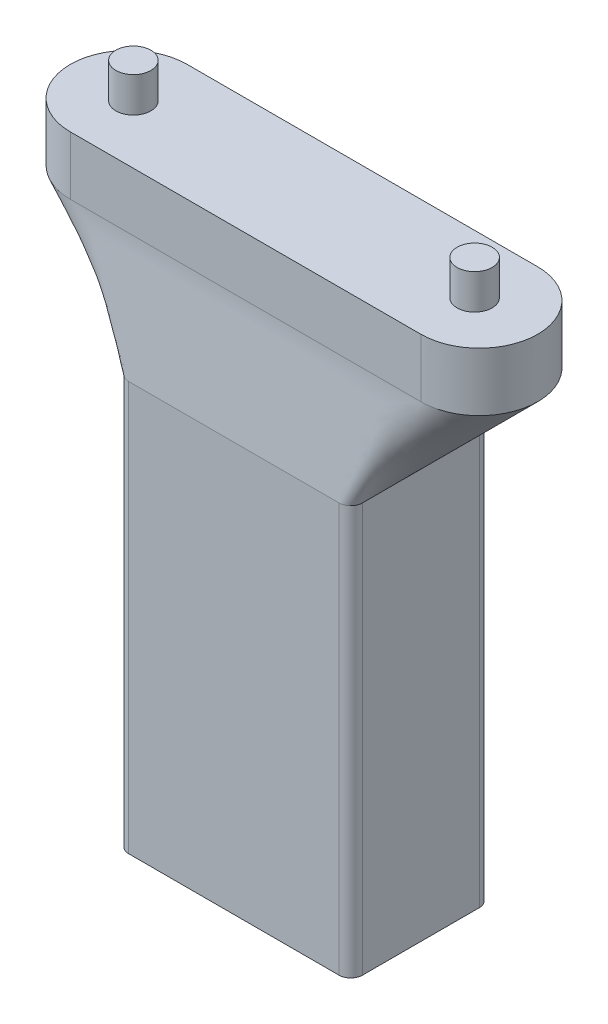
ISO-10303-21;
HEADER;
FILE_DESCRIPTION(('STEP AP214'),'2;1');
FILE_NAME('part.step','',(''),(''),'','','');
FILE_SCHEMA(('AUTOMOTIVE_DESIGN { 1 0 10303 214 1 1 1 1 }'));
ENDSEC;
DATA;
#1=APPLICATION_CONTEXT('core data for automotive mechanical design processes');
#2=APPLICATION_PROTOCOL_DEFINITION('international standard','automotive_design',2000,#1);
#3=PRODUCT_CONTEXT('',#1,'mechanical');
#4=PRODUCT('Part','Part','',(#3));
#5=PRODUCT_RELATED_PRODUCT_CATEGORY('part','',(#4));
#6=PRODUCT_DEFINITION_FORMATION('','',#4);
#7=PRODUCT_DEFINITION_CONTEXT('part definition',#1,'design');
#8=PRODUCT_DEFINITION('design','',#6,#7);
#9=PRODUCT_DEFINITION_SHAPE('','',#8);
#10=(LENGTH_UNIT() NAMED_UNIT(*) SI_UNIT(.MILLI.,.METRE.));
#11=(NAMED_UNIT(*) PLANE_ANGLE_UNIT() SI_UNIT($,.RADIAN.));
#12=(NAMED_UNIT(*) SI_UNIT($,.STERADIAN.) SOLID_ANGLE_UNIT());
#13=UNCERTAINTY_MEASURE_WITH_UNIT(LENGTH_MEASURE(1.E-05),#10,'distance_accuracy_value','');
#14=(GEOMETRIC_REPRESENTATION_CONTEXT(3) GLOBAL_UNCERTAINTY_ASSIGNED_CONTEXT((#13)) GLOBAL_UNIT_ASSIGNED_CONTEXT((#10,
#11,#12)) REPRESENTATION_CONTEXT('',''));
#15=CARTESIAN_POINT('',(0.,0.,0.));
#16=DIRECTION('',(0.,0.,1.));
#17=DIRECTION('',(1.,0.,0.));
#18=AXIS2_PLACEMENT_3D('',#15,#16,#17);
#19=CARTESIAN_POINT('',(0.,5.,0.));
#20=DIRECTION('',(0.,1.,0.));
#21=DIRECTION('',(0.,0.,1.));
#22=AXIS2_PLACEMENT_3D('',#19,#20,#21);
#23=PLANE('',#22);
#24=CARTESIAN_POINT('',(-35.8945814641997,5.,25.5133400592117));
#25=DIRECTION('',(0.,1.,0.));
#26=DIRECTION('',(0.,0.,1.));
#27=AXIS2_PLACEMENT_3D('',#24,#25,#26);
#28=CIRCLE('',#27,1.5);
#29=CARTESIAN_POINT('',(-35.8945814641997,5.,27.0133400592117));
#30=VERTEX_POINT('',#29);
#31=EDGE_CURVE('E12',#30,#30,#28,.T.);
#32=ORIENTED_EDGE('',*,*,#31,.F.);
#33=EDGE_LOOP('',(#32));
#34=FACE_BOUND('',#33,.T.);
#35=CARTESIAN_POINT('',(-6.69458146419971,5.,25.5133400592117));
#36=DIRECTION('',(0.,1.,0.));
#37=DIRECTION('',(0.,0.,1.));
#38=AXIS2_PLACEMENT_3D('',#35,#36,#37);
#39=CIRCLE('',#38,1.5);
#40=CARTESIAN_POINT('',(-6.69458146419971,5.,27.0133400592117));
#41=VERTEX_POINT('',#40);
#42=EDGE_CURVE('E644',#41,#41,#39,.T.);
#43=ORIENTED_EDGE('',*,*,#42,.F.);
#44=EDGE_LOOP('',(#43));
#45=FACE_BOUND('',#44,.T.);
#46=DIRECTION('',(1.,0.,0.));
#47=VECTOR('',#46,1.);
#48=CARTESIAN_POINT('',(0.,5.,30.5133400592117));
#49=LINE('',#48,#47);
#50=CARTESIAN_POINT('',(-36.2945814641997,5.,30.5133400592117));
#51=VERTEX_POINT('',#50);
#52=CARTESIAN_POINT('',(-6.29458146419974,5.,30.5133400592117));
#53=VERTEX_POINT('',#52);
#54=EDGE_CURVE('E647',#51,#53,#49,.T.);
#55=ORIENTED_EDGE('',*,*,#54,.T.);
#56=CARTESIAN_POINT('',(-6.2945814641997,5.,25.5133400592117));
#57=DIRECTION('',(0.,1.,0.));
#58=DIRECTION('',(0.,0.,1.));
#59=AXIS2_PLACEMENT_3D('',#56,#57,#58);
#60=CIRCLE('',#59,5.);
#61=CARTESIAN_POINT('',(-6.29458146419974,5.,20.5133400592117));
#62=VERTEX_POINT('',#61);
#63=EDGE_CURVE('E605',#62,#53,#60,.F.);
#64=ORIENTED_EDGE('',*,*,#63,.F.);
#65=DIRECTION('',(1.,0.,0.));
#66=VECTOR('',#65,1.);
#67=CARTESIAN_POINT('',(0.,5.,20.5133400592117));
#68=LINE('',#67,#66);
#69=CARTESIAN_POINT('',(-36.2945814641997,5.,20.5133400592117));
#70=VERTEX_POINT('',#69);
#71=EDGE_CURVE('E651',#70,#62,#68,.T.);
#72=ORIENTED_EDGE('',*,*,#71,.F.);
#73=CARTESIAN_POINT('',(-36.2945814641997,5.,25.5133400592117));
#74=DIRECTION('',(0.,1.,0.));
#75=DIRECTION('',(0.,0.,1.));
#76=AXIS2_PLACEMENT_3D('',#73,#74,#75);
#77=CIRCLE('',#76,5.);
#78=EDGE_CURVE('E280',#70,#51,#77,.T.);
#79=ORIENTED_EDGE('',*,*,#78,.T.);
#80=EDGE_LOOP('',(#55,#64,#72,#79));
#81=FACE_BOUND('',#80,.T.);
#82=ADVANCED_FACE('F239',(#34,#45,#81),#23,.T.);
#83=CARTESIAN_POINT('',(-35.8945814641997,8.,25.5133400592117));
#84=DIRECTION('',(0.,-1.,0.));
#85=DIRECTION('',(0.,0.,-1.));
#86=AXIS2_PLACEMENT_3D('',#83,#84,#85);
#87=CYLINDRICAL_SURFACE('',#86,1.5);
#88=CARTESIAN_POINT('',(-35.8945814641997,8.,25.5133400592117));
#89=DIRECTION('',(0.,1.,0.));
#90=DIRECTION('',(0.,0.,1.));
#91=AXIS2_PLACEMENT_3D('',#88,#89,#90);
#92=CIRCLE('',#91,1.5);
#93=CARTESIAN_POINT('',(-35.8945814641997,8.,27.0133400592117));
#94=VERTEX_POINT('',#93);
#95=EDGE_CURVE('E249',#94,#94,#92,.F.);
#96=ORIENTED_EDGE('',*,*,#95,.T.);
#97=EDGE_LOOP('',(#96));
#98=FACE_BOUND('',#97,.T.);
#99=ORIENTED_EDGE('',*,*,#31,.T.);
#100=EDGE_LOOP('',(#99));
#101=FACE_BOUND('',#100,.T.);
#102=ADVANCED_FACE('F633',(#98,#101),#87,.T.);
#103=CARTESIAN_POINT('',(0.,8.,0.));
#104=DIRECTION('',(0.,1.,0.));
#105=DIRECTION('',(0.,0.,1.));
#106=AXIS2_PLACEMENT_3D('',#103,#104,#105);
#107=PLANE('',#106);
#108=ORIENTED_EDGE('',*,*,#95,.F.);
#109=EDGE_LOOP('',(#108));
#110=FACE_BOUND('',#109,.T.);
#111=ADVANCED_FACE('F638',(#110),#107,.T.);
#112=CARTESIAN_POINT('',(-6.69458146419971,8.,25.5133400592117));
#113=DIRECTION('',(0.,-1.,0.));
#114=DIRECTION('',(0.,0.,-1.));
#115=AXIS2_PLACEMENT_3D('',#112,#113,#114);
#116=CYLINDRICAL_SURFACE('',#115,1.5);
#117=CARTESIAN_POINT('',(-6.69458146419971,8.,25.5133400592117));
#118=DIRECTION('',(0.,1.,0.));
#119=DIRECTION('',(0.,0.,1.));
#120=AXIS2_PLACEMENT_3D('',#117,#118,#119);
#121=CIRCLE('',#120,1.5);
#122=CARTESIAN_POINT('',(-6.69458146419971,8.,27.0133400592117));
#123=VERTEX_POINT('',#122);
#124=EDGE_CURVE('E654',#123,#123,#121,.T.);
#125=ORIENTED_EDGE('',*,*,#124,.F.);
#126=EDGE_LOOP('',(#125));
#127=FACE_BOUND('',#126,.T.);
#128=ORIENTED_EDGE('',*,*,#42,.T.);
#129=EDGE_LOOP('',(#128));
#130=FACE_BOUND('',#129,.T.);
#131=ADVANCED_FACE('F696',(#127,#130),#116,.T.);
#132=CARTESIAN_POINT('',(0.,8.,0.));
#133=DIRECTION('',(0.,1.,0.));
#134=DIRECTION('',(0.,0.,1.));
#135=AXIS2_PLACEMENT_3D('',#132,#133,#134);
#136=PLANE('',#135);
#137=ORIENTED_EDGE('',*,*,#124,.T.);
#138=EDGE_LOOP('',(#137));
#139=FACE_BOUND('',#138,.T.);
#140=ADVANCED_FACE('F680',(#139),#136,.T.);
#141=CARTESIAN_POINT('',(-36.2945814641997,0.,25.5133400592117));
#142=DIRECTION('',(0.,1.,0.));
#143=DIRECTION('',(0.,0.,1.));
#144=AXIS2_PLACEMENT_3D('',#141,#142,#143);
#145=CYLINDRICAL_SURFACE('',#144,5.);
#146=ORIENTED_EDGE('',*,*,#78,.F.);
#147=DIRECTION('',(0.,1.,0.));
#148=VECTOR('',#147,1.);
#149=CARTESIAN_POINT('',(-36.2945814641997,0.,20.5133400592117));
#150=LINE('',#149,#148);
#151=CARTESIAN_POINT('',(-36.2945814641997,0.,20.5133400592117));
#152=VERTEX_POINT('',#151);
#153=EDGE_CURVE('E257',#152,#70,#150,.T.);
#154=ORIENTED_EDGE('',*,*,#153,.F.);
#155=CARTESIAN_POINT('',(-6.29458146534728,0.,20.5133400592117));
#156=CARTESIAN_POINT('',(-5.64766332491657,0.,20.5133400592117));
#157=CARTESIAN_POINT('',(-4.3481647934617,0.,20.7675125474835));
#158=CARTESIAN_POINT('',(-2.6801952457436,0.,21.8717110803832));
#159=CARTESIAN_POINT('',(-1.55809888719889,0.,23.538457056297));
#160=CARTESIAN_POINT('',(-1.16253214015281,0.,25.5133400592118));
#161=CARTESIAN_POINT('',(-1.55809888719889,0.,27.4882230621264));
#162=CARTESIAN_POINT('',(-2.68019524574361,0.,29.1549690380402));
#163=CARTESIAN_POINT('',(-4.34816479346171,0.,30.25916757094));
#164=CARTESIAN_POINT('',(-5.64766332491658,0.,30.5133400592117));
#165=CARTESIAN_POINT('',(-6.47948771654112,0.,30.5133400592117));
#166=CARTESIAN_POINT('',(-6.8269866703791,0.,30.5133400592117));
#167=CARTESIAN_POINT('',(-7.32174343034788,0.,30.5133400592117));
#168=CARTESIAN_POINT('',(-7.81308682913417,0.,30.5133400592118));
#169=CARTESIAN_POINT('',(-8.15302398337131,0.,30.5133400592117));
#170=CARTESIAN_POINT('',(-10.4832783811346,0.,30.5133400592117));
#171=CARTESIAN_POINT('',(-14.7998372577758,0.,30.5133400592117));
#172=CARTESIAN_POINT('',(-21.2945814641997,0.,30.5133400592118));
#173=CARTESIAN_POINT('',(-27.7893256706236,0.,30.5133400592117));
#174=CARTESIAN_POINT('',(-32.1058845472648,0.,30.5133400592117));
#175=CARTESIAN_POINT('',(-34.4361389450281,0.,30.5133400592117));
#176=CARTESIAN_POINT('',(-34.7760760992652,0.,30.5133400592117));
#177=CARTESIAN_POINT('',(-35.2674194980516,0.,30.5133400592118));
#178=CARTESIAN_POINT('',(-35.7621762580203,0.,30.5133400592117));
#179=CARTESIAN_POINT('',(-36.1096752118583,0.,30.5133400592117));
#180=CARTESIAN_POINT('',(-36.9414996034828,0.,30.5133400592117));
#181=CARTESIAN_POINT('',(-38.2409981349377,0.,30.25916757094));
#182=CARTESIAN_POINT('',(-39.9089676826558,0.,29.1549690380402));
#183=CARTESIAN_POINT('',(-41.0310640412005,0.,27.4882230621264));
#184=CARTESIAN_POINT('',(-41.4266307882467,0.,25.5133400592117));
#185=CARTESIAN_POINT('',(-41.0310640412005,0.,23.5384570562971));
#186=CARTESIAN_POINT('',(-39.9089676826558,0.,21.8717110803832));
#187=CARTESIAN_POINT('',(-38.2409981349377,0.,20.7675125474835));
#188=CARTESIAN_POINT('',(-36.9414996034828,0.,20.5133400592117));
#189=CARTESIAN_POINT('',(-36.1096752118583,0.,20.5133400592117));
#190=CARTESIAN_POINT('',(-35.7621762580203,0.,20.5133400592117));
#191=CARTESIAN_POINT('',(-35.2674194980516,0.,20.5133400592117));
#192=CARTESIAN_POINT('',(-34.7760760992652,0.,20.5133400592117));
#193=CARTESIAN_POINT('',(-34.4361389450281,0.,20.5133400592117));
#194=CARTESIAN_POINT('',(-32.1058845472648,0.,20.5133400592117));
#195=CARTESIAN_POINT('',(-27.7893256706236,0.,20.5133400592118));
#196=CARTESIAN_POINT('',(-21.2945814641997,0.,20.5133400592117));
#197=CARTESIAN_POINT('',(-14.7998372577758,0.,20.5133400592118));
#198=CARTESIAN_POINT('',(-10.4832783811346,0.,20.5133400592117));
#199=CARTESIAN_POINT('',(-8.15302398337131,0.,20.5133400592117));
#200=CARTESIAN_POINT('',(-7.81308682913416,0.,20.5133400592117));
#201=CARTESIAN_POINT('',(-7.3217434303479,0.,20.5133400592117));
#202=CARTESIAN_POINT('',(-6.82698667037909,0.,20.5133400592117));
#203=CARTESIAN_POINT('',(-6.47948771654112,0.,20.5133400592117));
#204=CARTESIAN_POINT('',(-6.29458146534728,0.,20.5133400592117));
#205=B_SPLINE_CURVE_WITH_KNOTS('',3,(#155,#156,#157,#158,#159,#160,#161,#162,#163,#164,#165,
#166,#167,#168,#169,#170,#171,#172,#173,#174,#175,#176,#177,#178,#179,#180,#181,#182,#183,#184,
#185,#186,#187,#188,#189,#190,#191,#192,#193,#194,#195,#196,#197,#198,#199,#200,#201,#202,#203,
#204),.UNSPECIFIED.,.T.,.F.,(4,1,1,1,1,1,1,1,2,1,1,1,2,1,1,1,2,1,1,1,2,1,1,1,1,1,1,1,2,1,1,1,2,
1,1,1,2,1,1,1,4),(0.,0.0207741619169695,0.0415483238339387,0.0623224857509079,
0.0830966476678774,0.103870809584847,0.124644971501816,0.145419133418786,0.166193295335755,
0.172131098222536,0.178068901109318,0.184006703996099,0.18994450688288,0.261520577275379,
0.333096647667877,0.404672718060376,0.476248788452874,0.482186591339656,0.488124394226437,
0.494062197113219,0.5,0.520774161916969,0.541548323833939,0.562322485750908,0.583096647667877,
0.603870809584847,0.624644971501816,0.645419133418786,0.666193295335755,0.672131098222536,
0.678068901109318,0.684006703996099,0.68994450688288,0.761520577275379,0.833096647667877,
0.904672718060376,0.976248788452874,0.982186591339656,0.988124394226437,0.994062197113219,1.),.UNSPECIFIED.);
#206=CARTESIAN_POINT('',(-36.2945814641997,0.,30.5133400592117));
#207=VERTEX_POINT('',#206);
#208=EDGE_CURVE('E290',#152,#207,#205,.F.);
#209=ORIENTED_EDGE('',*,*,#208,.T.);
#210=DIRECTION('',(0.,1.,0.));
#211=VECTOR('',#210,1.);
#212=CARTESIAN_POINT('',(-36.2945814641997,0.,30.5133400592117));
#213=LINE('',#212,#211);
#214=EDGE_CURVE('E613',#207,#51,#213,.T.);
#215=ORIENTED_EDGE('',*,*,#214,.T.);
#216=EDGE_LOOP('',(#146,#154,#209,#215));
#217=FACE_BOUND('',#216,.T.);
#218=ADVANCED_FACE('F674',(#217),#145,.T.);
#219=CARTESIAN_POINT('',(-6.2945814641997,0.,25.5133400592117));
#220=DIRECTION('',(0.,1.,0.));
#221=DIRECTION('',(0.,0.,1.));
#222=AXIS2_PLACEMENT_3D('',#219,#220,#221);
#223=CYLINDRICAL_SURFACE('',#222,5.);
#224=ORIENTED_EDGE('',*,*,#63,.T.);
#225=DIRECTION('',(0.,1.,0.));
#226=VECTOR('',#225,1.);
#227=CARTESIAN_POINT('',(-6.29458146419974,0.,30.5133400592117));
#228=LINE('',#227,#226);
#229=CARTESIAN_POINT('',(-6.29458146419974,0.,30.5133400592117));
#230=VERTEX_POINT('',#229);
#231=EDGE_CURVE('E417',#230,#53,#228,.T.);
#232=ORIENTED_EDGE('',*,*,#231,.F.);
#233=CARTESIAN_POINT('',(-6.29458146534728,0.,20.5133400592117));
#234=CARTESIAN_POINT('',(-5.64766332491657,0.,20.5133400592117));
#235=CARTESIAN_POINT('',(-4.3481647934617,0.,20.7675125474835));
#236=CARTESIAN_POINT('',(-2.6801952457436,0.,21.8717110803832));
#237=CARTESIAN_POINT('',(-1.55809888719889,0.,23.538457056297));
#238=CARTESIAN_POINT('',(-1.16253214015281,0.,25.5133400592118));
#239=CARTESIAN_POINT('',(-1.55809888719889,0.,27.4882230621264));
#240=CARTESIAN_POINT('',(-2.68019524574361,0.,29.1549690380402));
#241=CARTESIAN_POINT('',(-4.34816479346171,0.,30.25916757094));
#242=CARTESIAN_POINT('',(-5.64766332491658,0.,30.5133400592117));
#243=CARTESIAN_POINT('',(-6.47948771654112,0.,30.5133400592117));
#244=CARTESIAN_POINT('',(-6.8269866703791,0.,30.5133400592117));
#245=CARTESIAN_POINT('',(-7.32174343034788,0.,30.5133400592117));
#246=CARTESIAN_POINT('',(-7.81308682913417,0.,30.5133400592118));
#247=CARTESIAN_POINT('',(-8.15302398337131,0.,30.5133400592117));
#248=CARTESIAN_POINT('',(-10.4832783811346,0.,30.5133400592117));
#249=CARTESIAN_POINT('',(-14.7998372577758,0.,30.5133400592117));
#250=CARTESIAN_POINT('',(-21.2945814641997,0.,30.5133400592118));
#251=CARTESIAN_POINT('',(-27.7893256706236,0.,30.5133400592117));
#252=CARTESIAN_POINT('',(-32.1058845472648,0.,30.5133400592117));
#253=CARTESIAN_POINT('',(-34.4361389450281,0.,30.5133400592117));
#254=CARTESIAN_POINT('',(-34.7760760992652,0.,30.5133400592117));
#255=CARTESIAN_POINT('',(-35.2674194980516,0.,30.5133400592118));
#256=CARTESIAN_POINT('',(-35.7621762580203,0.,30.5133400592117));
#257=CARTESIAN_POINT('',(-36.1096752118583,0.,30.5133400592117));
#258=CARTESIAN_POINT('',(-36.9414996034828,0.,30.5133400592117));
#259=CARTESIAN_POINT('',(-38.2409981349377,0.,30.25916757094));
#260=CARTESIAN_POINT('',(-39.9089676826558,0.,29.1549690380402));
#261=CARTESIAN_POINT('',(-41.0310640412005,0.,27.4882230621264));
#262=CARTESIAN_POINT('',(-41.4266307882467,0.,25.5133400592117));
#263=CARTESIAN_POINT('',(-41.0310640412005,0.,23.5384570562971));
#264=CARTESIAN_POINT('',(-39.9089676826558,0.,21.8717110803832));
#265=CARTESIAN_POINT('',(-38.2409981349377,0.,20.7675125474835));
#266=CARTESIAN_POINT('',(-36.9414996034828,0.,20.5133400592117));
#267=CARTESIAN_POINT('',(-36.1096752118583,0.,20.5133400592117));
#268=CARTESIAN_POINT('',(-35.7621762580203,0.,20.5133400592117));
#269=CARTESIAN_POINT('',(-35.2674194980516,0.,20.5133400592117));
#270=CARTESIAN_POINT('',(-34.7760760992652,0.,20.5133400592117));
#271=CARTESIAN_POINT('',(-34.4361389450281,0.,20.5133400592117));
#272=CARTESIAN_POINT('',(-32.1058845472648,0.,20.5133400592117));
#273=CARTESIAN_POINT('',(-27.7893256706236,0.,20.5133400592118));
#274=CARTESIAN_POINT('',(-21.2945814641997,0.,20.5133400592117));
#275=CARTESIAN_POINT('',(-14.7998372577758,0.,20.5133400592118));
#276=CARTESIAN_POINT('',(-10.4832783811346,0.,20.5133400592117));
#277=CARTESIAN_POINT('',(-8.15302398337131,0.,20.5133400592117));
#278=CARTESIAN_POINT('',(-7.81308682913416,0.,20.5133400592117));
#279=CARTESIAN_POINT('',(-7.3217434303479,0.,20.5133400592117));
#280=CARTESIAN_POINT('',(-6.82698667037909,0.,20.5133400592117));
#281=CARTESIAN_POINT('',(-6.47948771654112,0.,20.5133400592117));
#282=CARTESIAN_POINT('',(-6.29458146534728,0.,20.5133400592117));
#283=B_SPLINE_CURVE_WITH_KNOTS('',3,(#233,#234,#235,#236,#237,#238,#239,#240,#241,#242,#243,
#244,#245,#246,#247,#248,#249,#250,#251,#252,#253,#254,#255,#256,#257,#258,#259,#260,#261,#262,
#263,#264,#265,#266,#267,#268,#269,#270,#271,#272,#273,#274,#275,#276,#277,#278,#279,#280,#281,
#282),.UNSPECIFIED.,.T.,.F.,(4,1,1,1,1,1,1,1,2,1,1,1,2,1,1,1,2,1,1,1,2,1,1,1,1,1,1,1,2,1,1,1,2,
1,1,1,2,1,1,1,4),(0.,0.0207741619169695,0.0415483238339387,0.0623224857509079,
0.0830966476678774,0.103870809584847,0.124644971501816,0.145419133418786,0.166193295335755,
0.172131098222536,0.178068901109318,0.184006703996099,0.18994450688288,0.261520577275379,
0.333096647667877,0.404672718060376,0.476248788452874,0.482186591339656,0.488124394226437,
0.494062197113219,0.5,0.520774161916969,0.541548323833939,0.562322485750908,0.583096647667877,
0.603870809584847,0.624644971501816,0.645419133418786,0.666193295335755,0.672131098222536,
0.678068901109318,0.684006703996099,0.68994450688288,0.761520577275379,0.833096647667877,
0.904672718060376,0.976248788452874,0.982186591339656,0.988124394226437,0.994062197113219,1.),.UNSPECIFIED.);
#284=CARTESIAN_POINT('',(-6.29458146419974,0.,20.5133400592117));
#285=VERTEX_POINT('',#284);
#286=EDGE_CURVE('E598',#285,#230,#283,.T.);
#287=ORIENTED_EDGE('',*,*,#286,.F.);
#288=DIRECTION('',(0.,1.,0.));
#289=VECTOR('',#288,1.);
#290=CARTESIAN_POINT('',(-6.29458146419974,0.,20.5133400592117));
#291=LINE('',#290,#289);
#292=EDGE_CURVE('E602',#285,#62,#291,.T.);
#293=ORIENTED_EDGE('',*,*,#292,.T.);
#294=EDGE_LOOP('',(#224,#232,#287,#293));
#295=FACE_BOUND('',#294,.T.);
#296=ADVANCED_FACE('F664',(#295),#223,.T.);
#297=CARTESIAN_POINT('',(0.,0.,20.5133400592117));
#298=DIRECTION('',(0.,0.,1.));
#299=DIRECTION('',(1.,0.,0.));
#300=AXIS2_PLACEMENT_3D('',#297,#298,#299);
#301=PLANE('',#300);
#302=ORIENTED_EDGE('',*,*,#71,.T.);
#303=ORIENTED_EDGE('',*,*,#292,.F.);
#304=DIRECTION('',(1.,0.,0.));
#305=VECTOR('',#304,1.);
#306=CARTESIAN_POINT('',(0.,0.,20.5133400592117));
#307=LINE('',#306,#305);
#308=EDGE_CURVE('E599',#152,#285,#307,.T.);
#309=ORIENTED_EDGE('',*,*,#308,.F.);
#310=ORIENTED_EDGE('',*,*,#153,.T.);
#311=EDGE_LOOP('',(#302,#303,#309,#310));
#312=FACE_BOUND('',#311,.T.);
#313=ADVANCED_FACE('F673',(#312),#301,.F.);
#314=CARTESIAN_POINT('',(0.,0.,30.5133400592117));
#315=DIRECTION('',(0.,0.,1.));
#316=DIRECTION('',(1.,0.,0.));
#317=AXIS2_PLACEMENT_3D('',#314,#315,#316);
#318=PLANE('',#317);
#319=ORIENTED_EDGE('',*,*,#54,.F.);
#320=ORIENTED_EDGE('',*,*,#214,.F.);
#321=DIRECTION('',(1.,0.,0.));
#322=VECTOR('',#321,1.);
#323=CARTESIAN_POINT('',(0.,0.,30.5133400592117));
#324=LINE('',#323,#322);
#325=EDGE_CURVE('E272',#207,#230,#324,.T.);
#326=ORIENTED_EDGE('',*,*,#325,.T.);
#327=ORIENTED_EDGE('',*,*,#231,.T.);
#328=EDGE_LOOP('',(#319,#320,#326,#327));
#329=FACE_BOUND('',#328,.T.);
#330=ADVANCED_FACE('F543',(#329),#318,.T.);
#331=CARTESIAN_POINT('',(-11.2945814641997,-10.,20.5133400598219));
#332=CARTESIAN_POINT('',(-6.29458146534728,0.,20.5133400592117));
#333=CARTESIAN_POINT('',(-11.2945814641997,-10.,20.3927695681912));
#334=CARTESIAN_POINT('',(-6.47948771654112,0.,20.5133400592117));
#335=CARTESIAN_POINT('',(-11.3388989244325,-10.,20.1395078354954));
#336=CARTESIAN_POINT('',(-6.82698667037909,0.,20.5133400592117));
#337=CARTESIAN_POINT('',(-11.561058059709,-9.99999999999996,19.7922667452044));
#338=CARTESIAN_POINT('',(-7.3217434303479,0.,20.5133400592117));
#339=CARTESIAN_POINT('',(-11.9085695661853,-10.,19.5611472862102));
#340=CARTESIAN_POINT('',(-7.81308682913416,0.,20.5133400592117));
#341=CARTESIAN_POINT('',(-12.1696494947626,-10.,19.5133400592117));
#342=CARTESIAN_POINT('',(-8.15302398337131,0.,20.5133400592117));
#343=CARTESIAN_POINT('',(-13.8005491878493,-10.,19.5133400592117));
#344=CARTESIAN_POINT('',(-10.4832783811346,0.,20.5133400592117));
#345=CARTESIAN_POINT('',(-16.8034805635051,-9.99999999999999,19.5133400592117));
#346=CARTESIAN_POINT('',(-14.7998372577758,0.,20.5133400592118));
#347=CARTESIAN_POINT('',(-21.2945814641997,-10.,19.5133400592117));
#348=CARTESIAN_POINT('',(-21.2945814641997,0.,20.5133400592117));
#349=CARTESIAN_POINT('',(-25.7856823648944,-9.99999999999999,19.5133400592117));
#350=CARTESIAN_POINT('',(-27.7893256706236,0.,20.5133400592118));
#351=CARTESIAN_POINT('',(-28.7886137405501,-10.,19.5133400592117));
#352=CARTESIAN_POINT('',(-32.1058845472648,0.,20.5133400592117));
#353=CARTESIAN_POINT('',(-30.4195134336368,-10.,19.5133400592117));
#354=CARTESIAN_POINT('',(-34.4361389450281,0.,20.5133400592117));
#355=CARTESIAN_POINT('',(-30.680593362214,-9.99999999999999,19.5611472862101));
#356=CARTESIAN_POINT('',(-34.7760760992652,0.,20.5133400592117));
#357=CARTESIAN_POINT('',(-31.0281048686905,-10.,19.7922667452044));
#358=CARTESIAN_POINT('',(-35.2674194980516,0.,20.5133400592117));
#359=CARTESIAN_POINT('',(-31.2502640039669,-9.99999999999999,20.1395078354953));
#360=CARTESIAN_POINT('',(-35.7621762580203,0.,20.5133400592117));
#361=CARTESIAN_POINT('',(-31.2945814641997,-10.,20.3927695681912));
#362=CARTESIAN_POINT('',(-36.1096752118583,0.,20.5133400592117));
#363=CARTESIAN_POINT('',(-31.2945814641997,-10.,20.9351713269257));
#364=CARTESIAN_POINT('',(-36.9414996034828,0.,20.5133400592117));
#365=CARTESIAN_POINT('',(-31.2945814641997,-10.,21.7748902660275));
#366=CARTESIAN_POINT('',(-38.2409981349377,0.,20.7675125474835));
#367=CARTESIAN_POINT('',(-31.2945814641997,-9.99999999999999,23.0257358740278));
#368=CARTESIAN_POINT('',(-39.9089676826558,0.,21.8717110803832));
#369=CARTESIAN_POINT('',(-31.2945814641997,-10.,24.2709466697014));
#370=CARTESIAN_POINT('',(-41.0310640412005,0.,23.5384570562971));
#371=CARTESIAN_POINT('',(-31.2945814641997,-10.,25.5133400592117));
#372=CARTESIAN_POINT('',(-41.4266307882467,0.,25.5133400592117));
#373=CARTESIAN_POINT('',(-31.2945814641997,-10.,26.755733448722));
#374=CARTESIAN_POINT('',(-41.0310640412005,0.,27.4882230621264));
#375=CARTESIAN_POINT('',(-31.2945814641997,-9.99999999999999,28.0009442443957));
#376=CARTESIAN_POINT('',(-39.9089676826558,0.,29.1549690380402));
#377=CARTESIAN_POINT('',(-31.2945814641997,-10.,29.251789852396));
#378=CARTESIAN_POINT('',(-38.2409981349377,0.,30.25916757094));
#379=CARTESIAN_POINT('',(-31.2945814641997,-10.,30.0915087914978));
#380=CARTESIAN_POINT('',(-36.9414996034828,0.,30.5133400592117));
#381=CARTESIAN_POINT('',(-31.2945814641997,-10.,30.6339105502323));
#382=CARTESIAN_POINT('',(-36.1096752118583,0.,30.5133400592117));
#383=CARTESIAN_POINT('',(-31.250264003967,-10.,30.8871722829281));
#384=CARTESIAN_POINT('',(-35.7621762580203,0.,30.5133400592117));
#385=CARTESIAN_POINT('',(-31.0281048686904,-9.99999999999998,31.2344133732191));
#386=CARTESIAN_POINT('',(-35.2674194980516,0.,30.5133400592118));
#387=CARTESIAN_POINT('',(-30.6805933622141,-10.,31.4655328322133));
#388=CARTESIAN_POINT('',(-34.7760760992652,0.,30.5133400592117));
#389=CARTESIAN_POINT('',(-30.4195134336368,-10.,31.5133400592117));
#390=CARTESIAN_POINT('',(-34.4361389450281,0.,30.5133400592117));
#391=CARTESIAN_POINT('',(-28.7886137405501,-10.,31.5133400592117));
#392=CARTESIAN_POINT('',(-32.1058845472648,0.,30.5133400592117));
#393=CARTESIAN_POINT('',(-25.7856823648943,-10.,31.5133400592117));
#394=CARTESIAN_POINT('',(-27.7893256706236,0.,30.5133400592117));
#395=CARTESIAN_POINT('',(-21.2945814641997,-10.,31.5133400592117));
#396=CARTESIAN_POINT('',(-21.2945814641997,0.,30.5133400592118));
#397=CARTESIAN_POINT('',(-16.8034805635051,-10.,31.5133400592118));
#398=CARTESIAN_POINT('',(-14.7998372577758,0.,30.5133400592117));
#399=CARTESIAN_POINT('',(-13.8005491878493,-10.,31.5133400592117));
#400=CARTESIAN_POINT('',(-10.4832783811346,0.,30.5133400592117));
#401=CARTESIAN_POINT('',(-12.1696494947626,-10.,31.5133400592117));
#402=CARTESIAN_POINT('',(-8.15302398337131,0.,30.5133400592117));
#403=CARTESIAN_POINT('',(-11.9085695661853,-9.99999999999999,31.4655328322133));
#404=CARTESIAN_POINT('',(-7.81308682913417,0.,30.5133400592118));
#405=CARTESIAN_POINT('',(-11.561058059709,-10.,31.2344133732191));
#406=CARTESIAN_POINT('',(-7.32174343034788,0.,30.5133400592117));
#407=CARTESIAN_POINT('',(-11.3388989244325,-10.,30.8871722829281));
#408=CARTESIAN_POINT('',(-6.8269866703791,0.,30.5133400592117));
#409=CARTESIAN_POINT('',(-11.2945814641997,-10.,30.6339105502323));
#410=CARTESIAN_POINT('',(-6.47948771654112,0.,30.5133400592117));
#411=CARTESIAN_POINT('',(-11.2945814641997,-10.,30.0915087914978));
#412=CARTESIAN_POINT('',(-5.64766332491657,0.,30.5133400592117));
#413=CARTESIAN_POINT('',(-11.2945814641997,-10.,29.251789852396));
#414=CARTESIAN_POINT('',(-4.34816479346171,0.,30.25916757094));
#415=CARTESIAN_POINT('',(-11.2945814641997,-10.,28.0009442443957));
#416=CARTESIAN_POINT('',(-2.6801952457436,0.,29.1549690380402));
#417=CARTESIAN_POINT('',(-11.2945814641997,-10.,26.755733448722));
#418=CARTESIAN_POINT('',(-1.55809888719889,0.,27.4882230621264));
#419=CARTESIAN_POINT('',(-11.2945814641997,-9.99999999999999,25.5133400592117));
#420=CARTESIAN_POINT('',(-1.1625321401528,0.,25.5133400592118));
#421=CARTESIAN_POINT('',(-11.2945814641997,-10.,24.2709466697014));
#422=CARTESIAN_POINT('',(-1.55809888719889,0.,23.538457056297));
#423=CARTESIAN_POINT('',(-11.2945814641997,-10.,23.0257358740278));
#424=CARTESIAN_POINT('',(-2.6801952457436,0.,21.8717110803832));
#425=CARTESIAN_POINT('',(-11.2945814641997,-10.,21.7748902660275));
#426=CARTESIAN_POINT('',(-4.3481647934617,0.,20.7675125474835));
#427=CARTESIAN_POINT('',(-11.2945814641997,-10.,20.9351713269257));
#428=CARTESIAN_POINT('',(-5.64766332491657,0.,20.5133400592117));
#429=CARTESIAN_POINT('',(-11.2945814641997,-10.,20.5133400598219));
#430=CARTESIAN_POINT('',(-6.29458146534728,0.,20.5133400592117));
#431=B_SPLINE_SURFACE_WITH_KNOTS('',3,1,((#331,#332),(#333,#334),(#335,#336),(#337,#338),(#339,
#340),(#341,#342),(#343,#344),(#345,#346),(#347,#348),(#349,#350),(#351,#352),(#353,#354),(#355,
#356),(#357,#358),(#359,#360),(#361,#362),(#363,#364),(#365,#366),(#367,#368),(#369,#370),(#371,
#372),(#373,#374),(#375,#376),(#377,#378),(#379,#380),(#381,#382),(#383,#384),(#385,#386),(#387,
#388),(#389,#390),(#391,#392),(#393,#394),(#395,#396),(#397,#398),(#399,#400),(#401,#402),(#403,
#404),(#405,#406),(#407,#408),(#409,#410),(#411,#412),(#413,#414),(#415,#416),(#417,#418),(#419,
#420),(#421,#422),(#423,#424),(#425,#426),(#427,#428),(#429,#430)),.UNSPECIFIED.,.T.,.F.,.F.,(4,
1,1,1,2,1,1,1,2,1,1,1,2,1,1,1,1,1,1,1,2,1,1,1,2,1,1,1,2,1,1,1,2,1,1,1,1,1,1,1,4),(2,2),(0.,
0.00593780288678138,0.0118756057735628,0.0178134086603442,0.0237512115471255,0.095327281939624,
0.166903352332123,0.238479422724621,0.31005549311712,0.315993296003901,0.321931098890682,
0.327868901777464,0.333806704664245,0.354580866581215,0.375355028498184,0.396129190415153,
0.416903352332123,0.437677514249092,0.458451676166061,0.479225838083031,0.5,0.505937802886781,
0.511875605773563,0.517813408660344,0.523751211547126,0.595327281939624,0.666903352332123,
0.738479422724621,0.81005549311712,0.815993296003901,0.821931098890682,0.827868901777464,
0.833806704664245,0.854580866581214,0.875355028498184,0.896129190415153,0.916903352332123,
0.937677514249092,0.958451676166061,0.979225838083031,1.),(0.,1.),.UNSPECIFIED.);
#432=CARTESIAN_POINT('',(-30.2945814641997,-10.,20.5133400592117));
#433=DIRECTION('',(0.,-1.,0.));
#434=DIRECTION('',(0.,0.,-1.));
#435=AXIS2_PLACEMENT_3D('',#432,#433,#434);
#436=CIRCLE('',#435,1.);
#437=CARTESIAN_POINT('',(-31.2945814641997,-10.,20.5133400592117));
#438=VERTEX_POINT('',#437);
#439=CARTESIAN_POINT('',(-30.2945814641997,-10.,19.5133400592117));
#440=VERTEX_POINT('',#439);
#441=EDGE_CURVE('E242',#438,#440,#436,.T.);
#442=DIRECTION('',(0.,0.,-1.));
#443=VECTOR('',#442,1.);
#444=CARTESIAN_POINT('',(-31.2945814641997,-10.,30.5133400592117));
#445=LINE('',#444,#443);
#446=CARTESIAN_POINT('',(-31.2945814641997,-10.,30.5133400592117));
#447=VERTEX_POINT('',#446);
#448=EDGE_CURVE('E369',#447,#438,#445,.T.);
#449=CARTESIAN_POINT('',(-30.2945814641997,-10.,30.5133400592117));
#450=DIRECTION('',(0.,-1.,0.));
#451=DIRECTION('',(0.,0.,-1.));
#452=AXIS2_PLACEMENT_3D('',#449,#450,#451);
#453=CIRCLE('',#452,1.);
#454=CARTESIAN_POINT('',(-30.2945814641997,-10.,31.5133400592117));
#455=VERTEX_POINT('',#454);
#456=EDGE_CURVE('E459',#455,#447,#453,.T.);
#457=DIRECTION('',(-1.,0.,0.));
#458=VECTOR('',#457,1.);
#459=CARTESIAN_POINT('',(-30.2945814641997,-10.,31.5133400592117));
#460=LINE('',#459,#458);
#461=CARTESIAN_POINT('',(-12.2945814641997,-10.,31.5133400592117));
#462=VERTEX_POINT('',#461);
#463=EDGE_CURVE('E448',#462,#455,#460,.T.);
#464=CARTESIAN_POINT('',(-12.2945814641997,-10.,30.5133400592117));
#465=DIRECTION('',(0.,-1.,0.));
#466=DIRECTION('',(0.,0.,-1.));
#467=AXIS2_PLACEMENT_3D('',#464,#465,#466);
#468=CIRCLE('',#467,1.);
#469=CARTESIAN_POINT('',(-11.2945814641997,-10.,30.5133400592117));
#470=VERTEX_POINT('',#469);
#471=EDGE_CURVE('E433',#470,#462,#468,.T.);
#472=DIRECTION('',(0.,0.,1.));
#473=VECTOR('',#472,1.);
#474=CARTESIAN_POINT('',(-11.2945814641997,-10.,30.5133400592117));
#475=LINE('',#474,#473);
#476=CARTESIAN_POINT('',(-11.2945814641997,-10.,20.5133400592117));
#477=VERTEX_POINT('',#476);
#478=EDGE_CURVE('E430',#477,#470,#475,.T.);
#479=CARTESIAN_POINT('',(-12.2945814641997,-10.,20.5133400592117));
#480=DIRECTION('',(0.,-1.,0.));
#481=DIRECTION('',(0.,0.,-1.));
#482=AXIS2_PLACEMENT_3D('',#479,#480,#481);
#483=CIRCLE('',#482,1.);
#484=CARTESIAN_POINT('',(-12.2945814641997,-10.,19.5133400592117));
#485=VERTEX_POINT('',#484);
#486=EDGE_CURVE('E382',#485,#477,#483,.T.);
#487=DIRECTION('',(1.,0.,0.));
#488=VECTOR('',#487,1.);
#489=CARTESIAN_POINT('',(-30.2945814641997,-10.,19.5133400592117));
#490=LINE('',#489,#488);
#491=EDGE_CURVE('E298',#440,#485,#490,.T.);
#492=CARTESIAN_POINT('',(-21.2945814641997,-10.,31.5133400592117));
#493=CARTESIAN_POINT('',(-21.2945814641997,0.,30.5133400592117));
#494=CARTESIAN_POINT('',(-19.7975478306348,-10.,31.5133400592117));
#495=CARTESIAN_POINT('',(-19.1296667287251,0.,30.5133400592117));
#496=CARTESIAN_POINT('',(-16.8034805635051,-10.,31.5133400592118));
#497=CARTESIAN_POINT('',(-14.7998372577758,0.,30.5133400592117));
#498=CARTESIAN_POINT('',(-13.8005491878493,-10.,31.5133400592117));
#499=CARTESIAN_POINT('',(-10.4832783811346,0.,30.5133400592117));
#500=CARTESIAN_POINT('',(-12.1696494947626,-10.,31.5133400592117));
#501=CARTESIAN_POINT('',(-8.15302398337131,0.,30.5133400592117));
#502=CARTESIAN_POINT('',(-11.9085695661853,-9.99999999999999,31.4655328322133));
#503=CARTESIAN_POINT('',(-7.81308682913417,0.,30.5133400592118));
#504=CARTESIAN_POINT('',(-11.561058059709,-10.,31.2344133732191));
#505=CARTESIAN_POINT('',(-7.32174343034788,0.,30.5133400592117));
#506=CARTESIAN_POINT('',(-11.3388989244325,-10.,30.8871722829281));
#507=CARTESIAN_POINT('',(-6.8269866703791,0.,30.5133400592117));
#508=CARTESIAN_POINT('',(-11.2945814641997,-10.,30.6339105502323));
#509=CARTESIAN_POINT('',(-6.47948771654112,0.,30.5133400592117));
#510=CARTESIAN_POINT('',(-11.2945814641997,-10.,30.0915087914978));
#511=CARTESIAN_POINT('',(-5.64766332491657,0.,30.5133400592117));
#512=CARTESIAN_POINT('',(-11.2945814641997,-10.,29.251789852396));
#513=CARTESIAN_POINT('',(-4.34816479346171,0.,30.25916757094));
#514=CARTESIAN_POINT('',(-11.2945814641997,-10.,28.0009442443957));
#515=CARTESIAN_POINT('',(-2.6801952457436,0.,29.1549690380402));
#516=CARTESIAN_POINT('',(-11.2945814641997,-10.,26.755733448722));
#517=CARTESIAN_POINT('',(-1.55809888719889,0.,27.4882230621264));
#518=CARTESIAN_POINT('',(-11.2945814641997,-9.99999999999999,25.5133400592117));
#519=CARTESIAN_POINT('',(-1.1625321401528,0.,25.5133400592118));
#520=CARTESIAN_POINT('',(-11.2945814641997,-10.,24.2709466697014));
#521=CARTESIAN_POINT('',(-1.55809888719889,0.,23.538457056297));
#522=CARTESIAN_POINT('',(-11.2945814641997,-10.,23.0257358740278));
#523=CARTESIAN_POINT('',(-2.6801952457436,0.,21.8717110803832));
#524=CARTESIAN_POINT('',(-11.2945814641997,-10.,21.7748902660275));
#525=CARTESIAN_POINT('',(-4.3481647934617,0.,20.7675125474835));
#526=CARTESIAN_POINT('',(-11.2945814641997,-10.,20.9351713269257));
#527=CARTESIAN_POINT('',(-5.64766332491657,0.,20.5133400592117));
#528=CARTESIAN_POINT('',(-11.2945814641997,-10.,20.3927695681912));
#529=CARTESIAN_POINT('',(-6.47948771654112,0.,20.5133400592117));
#530=CARTESIAN_POINT('',(-11.3388989244325,-10.,20.1395078354954));
#531=CARTESIAN_POINT('',(-6.82698667037909,0.,20.5133400592117));
#532=CARTESIAN_POINT('',(-11.561058059709,-9.99999999999996,19.7922667452044));
#533=CARTESIAN_POINT('',(-7.3217434303479,0.,20.5133400592117));
#534=CARTESIAN_POINT('',(-11.9085695661853,-10.,19.5611472862102));
#535=CARTESIAN_POINT('',(-7.81308682913416,0.,20.5133400592117));
#536=CARTESIAN_POINT('',(-12.1696494947626,-10.,19.5133400592117));
#537=CARTESIAN_POINT('',(-8.15302398337131,0.,20.5133400592117));
#538=CARTESIAN_POINT('',(-13.8005491878493,-10.,19.5133400592117));
#539=CARTESIAN_POINT('',(-10.4832783811346,0.,20.5133400592117));
#540=CARTESIAN_POINT('',(-16.8034805635051,-9.99999999999999,19.5133400592117));
#541=CARTESIAN_POINT('',(-14.7998372577758,0.,20.5133400592118));
#542=CARTESIAN_POINT('',(-21.2945814641997,-10.,19.5133400592117));
#543=CARTESIAN_POINT('',(-21.2945814641997,0.,20.5133400592117));
#544=CARTESIAN_POINT('',(-25.7856823648944,-9.99999999999999,19.5133400592117));
#545=CARTESIAN_POINT('',(-27.7893256706236,0.,20.5133400592118));
#546=CARTESIAN_POINT('',(-28.7886137405501,-10.,19.5133400592117));
#547=CARTESIAN_POINT('',(-32.1058845472648,0.,20.5133400592117));
#548=CARTESIAN_POINT('',(-30.4195134336368,-10.,19.5133400592117));
#549=CARTESIAN_POINT('',(-34.4361389450281,0.,20.5133400592117));
#550=CARTESIAN_POINT('',(-30.680593362214,-9.99999999999999,19.5611472862101));
#551=CARTESIAN_POINT('',(-34.7760760992652,0.,20.5133400592117));
#552=CARTESIAN_POINT('',(-31.0281048686905,-10.,19.7922667452044));
#553=CARTESIAN_POINT('',(-35.2674194980516,0.,20.5133400592117));
#554=CARTESIAN_POINT('',(-31.2502640039669,-9.99999999999999,20.1395078354953));
#555=CARTESIAN_POINT('',(-35.7621762580203,0.,20.5133400592117));
#556=CARTESIAN_POINT('',(-31.2945814641997,-10.,20.3927695681912));
#557=CARTESIAN_POINT('',(-36.1096752118583,0.,20.5133400592117));
#558=CARTESIAN_POINT('',(-31.2945814641997,-10.,20.9351713269257));
#559=CARTESIAN_POINT('',(-36.9414996034828,0.,20.5133400592117));
#560=CARTESIAN_POINT('',(-31.2945814641997,-10.,21.7748902660275));
#561=CARTESIAN_POINT('',(-38.2409981349377,0.,20.7675125474835));
#562=CARTESIAN_POINT('',(-31.2945814641997,-9.99999999999999,23.0257358740278));
#563=CARTESIAN_POINT('',(-39.9089676826558,0.,21.8717110803832));
#564=CARTESIAN_POINT('',(-31.2945814641997,-10.,24.2709466697014));
#565=CARTESIAN_POINT('',(-41.0310640412005,0.,23.5384570562971));
#566=CARTESIAN_POINT('',(-31.2945814641997,-10.,25.5133400592117));
#567=CARTESIAN_POINT('',(-41.4266307882467,0.,25.5133400592117));
#568=CARTESIAN_POINT('',(-31.2945814641997,-10.,26.755733448722));
#569=CARTESIAN_POINT('',(-41.0310640412005,0.,27.4882230621264));
#570=CARTESIAN_POINT('',(-31.2945814641997,-9.99999999999999,28.0009442443957));
#571=CARTESIAN_POINT('',(-39.9089676826558,0.,29.1549690380402));
#572=CARTESIAN_POINT('',(-31.2945814641997,-10.,29.251789852396));
#573=CARTESIAN_POINT('',(-38.2409981349377,0.,30.25916757094));
#574=CARTESIAN_POINT('',(-31.2945814641997,-10.,30.0915087914978));
#575=CARTESIAN_POINT('',(-36.9414996034828,0.,30.5133400592117));
#576=CARTESIAN_POINT('',(-31.2945814641997,-10.,30.6339105502323));
#577=CARTESIAN_POINT('',(-36.1096752118583,0.,30.5133400592117));
#578=CARTESIAN_POINT('',(-31.250264003967,-10.,30.8871722829281));
#579=CARTESIAN_POINT('',(-35.7621762580203,0.,30.5133400592117));
#580=CARTESIAN_POINT('',(-31.0281048686904,-9.99999999999998,31.2344133732191));
#581=CARTESIAN_POINT('',(-35.2674194980516,0.,30.5133400592118));
#582=CARTESIAN_POINT('',(-30.6805933622141,-10.,31.4655328322133));
#583=CARTESIAN_POINT('',(-34.7760760992652,0.,30.5133400592117));
#584=CARTESIAN_POINT('',(-30.4195134336368,-10.,31.5133400592117));
#585=CARTESIAN_POINT('',(-34.4361389450281,0.,30.5133400592117));
#586=CARTESIAN_POINT('',(-28.7886137405501,-10.,31.5133400592117));
#587=CARTESIAN_POINT('',(-32.1058845472648,0.,30.5133400592117));
#588=CARTESIAN_POINT('',(-25.7856823648943,-10.,31.5133400592117));
#589=CARTESIAN_POINT('',(-27.7893256706236,0.,30.5133400592117));
#590=CARTESIAN_POINT('',(-22.7916150977646,-10.,31.5133400592117));
#591=CARTESIAN_POINT('',(-23.4594961996743,0.,30.5133400592117));
#592=CARTESIAN_POINT('',(-21.2945814641997,-10.,31.5133400592117));
#593=CARTESIAN_POINT('',(-21.2945814641997,0.,30.5133400592117));
#594=B_SPLINE_SURFACE_WITH_KNOTS('',3,1,((#492,#493),(#494,#495),(#496,#497),(#498,#499),(#500,
#501),(#502,#503),(#504,#505),(#506,#507),(#508,#509),(#510,#511),(#512,#513),(#514,#515),(#516,
#517),(#518,#519),(#520,#521),(#522,#523),(#524,#525),(#526,#527),(#528,#529),(#530,#531),(#532,
#533),(#534,#535),(#536,#537),(#538,#539),(#540,#541),(#542,#543),(#544,#545),(#546,#547),(#548,
#549),(#550,#551),(#552,#553),(#554,#555),(#556,#557),(#558,#559),(#560,#561),(#562,#563),(#564,
#565),(#566,#567),(#568,#569),(#570,#571),(#572,#573),(#574,#575),(#576,#577),(#578,#579),(#580,
#581),(#582,#583),(#584,#585),(#586,#587),(#588,#589),(#590,#591),(#592,#593)),.UNSPECIFIED.,
.T.,.F.,.F.,(4,1,2,1,1,1,2,1,1,1,1,1,1,1,2,1,1,1,2,1,1,1,2,1,1,1,2,1,1,1,1,1,1,1,2,1,1,1,2,1,4),
(2,2),(0.666903352332123,0.738479422724621,0.81005549311712,0.815993296003901,0.821931098890682,
0.827868901777464,0.833806704664245,0.854580866581214,0.875355028498184,0.896129190415153,
0.916903352332123,0.937677514249092,0.958451676166061,0.979225838083031,1.,1.00593780288678,
1.01187560577356,1.01781340866034,1.02375121154713,1.09532728193962,1.16690335233212,
1.23847942272462,1.31005549311712,1.3159932960039,1.32193109889068,1.32786890177746,
1.33380670466425,1.35458086658121,1.37535502849818,1.39612919041515,1.41690335233212,
1.43767751424909,1.45845167616606,1.47922583808303,1.5,1.50593780288678,1.51187560577356,
1.51781340866034,1.52375121154713,1.59532728193962,1.66690335233212),(0.,1.),.UNSPECIFIED.);
#595=ORIENTED_EDGE('',*,*,#441,.F.);
#596=ORIENTED_EDGE('',*,*,#448,.F.);
#597=ORIENTED_EDGE('',*,*,#456,.F.);
#598=ORIENTED_EDGE('',*,*,#463,.F.);
#599=ORIENTED_EDGE('',*,*,#471,.F.);
#600=ORIENTED_EDGE('',*,*,#478,.F.);
#601=ORIENTED_EDGE('',*,*,#486,.F.);
#602=ORIENTED_EDGE('',*,*,#491,.F.);
#603=EDGE_LOOP('',(#595,#596,#597,#598,#599,#600,#601,#602));
#604=FACE_BOUND('',#603,.T.);
#605=ORIENTED_EDGE('',*,*,#308,.T.);
#606=ORIENTED_EDGE('',*,*,#286,.T.);
#607=ORIENTED_EDGE('',*,*,#325,.F.);
#608=ORIENTED_EDGE('',*,*,#208,.F.);
#609=EDGE_LOOP('',(#605,#606,#607,#608));
#610=FACE_BOUND('',#609,.T.);
#611=ADVANCED_FACE('F532',(#604,#610),#594,.T.);
#612=CARTESIAN_POINT('',(-30.2945814641997,-45.,20.5133400592117));
#613=DIRECTION('',(0.,1.,0.));
#614=DIRECTION('',(0.,0.,1.));
#615=AXIS2_PLACEMENT_3D('',#612,#613,#614);
#616=CYLINDRICAL_SURFACE('',#615,1.);
#617=ORIENTED_EDGE('',*,*,#441,.T.);
#618=DIRECTION('',(0.,1.,0.));
#619=VECTOR('',#618,1.);
#620=CARTESIAN_POINT('',(-30.2945814641997,-45.,19.5133400592117));
#621=LINE('',#620,#619);
#622=CARTESIAN_POINT('',(-30.2945814641997,-45.,19.5133400592117));
#623=VERTEX_POINT('',#622);
#624=EDGE_CURVE('E349',#623,#440,#621,.T.);
#625=ORIENTED_EDGE('',*,*,#624,.F.);
#626=CARTESIAN_POINT('',(-30.2945814641997,-45.,20.5133400592117));
#627=DIRECTION('',(0.,-1.,0.));
#628=DIRECTION('',(0.,0.,-1.));
#629=AXIS2_PLACEMENT_3D('',#626,#627,#628);
#630=CIRCLE('',#629,1.);
#631=CARTESIAN_POINT('',(-31.2945814641997,-45.,20.5133400592117));
#632=VERTEX_POINT('',#631);
#633=EDGE_CURVE('E356',#632,#623,#630,.T.);
#634=ORIENTED_EDGE('',*,*,#633,.F.);
#635=DIRECTION('',(0.,1.,0.));
#636=VECTOR('',#635,1.);
#637=CARTESIAN_POINT('',(-31.2945814641997,-45.,20.5133400592117));
#638=LINE('',#637,#636);
#639=EDGE_CURVE('E525',#632,#438,#638,.T.);
#640=ORIENTED_EDGE('',*,*,#639,.T.);
#641=EDGE_LOOP('',(#617,#625,#634,#640));
#642=FACE_BOUND('',#641,.T.);
#643=ADVANCED_FACE('F366',(#642),#616,.T.);
#644=CARTESIAN_POINT('',(-30.2945814641997,-45.,19.5133400592117));
#645=DIRECTION('',(0.,0.,1.));
#646=DIRECTION('',(1.,0.,0.));
#647=AXIS2_PLACEMENT_3D('',#644,#645,#646);
#648=PLANE('',#647);
#649=ORIENTED_EDGE('',*,*,#491,.T.);
#650=DIRECTION('',(0.,1.,0.));
#651=VECTOR('',#650,1.);
#652=CARTESIAN_POINT('',(-12.2945814641997,-45.,19.5133400592117));
#653=LINE('',#652,#651);
#654=CARTESIAN_POINT('',(-12.2945814641997,-45.,19.5133400592117));
#655=VERTEX_POINT('',#654);
#656=EDGE_CURVE('E352',#655,#485,#653,.T.);
#657=ORIENTED_EDGE('',*,*,#656,.F.);
#658=DIRECTION('',(1.,0.,0.));
#659=VECTOR('',#658,1.);
#660=CARTESIAN_POINT('',(-30.2945814641997,-45.,19.5133400592117));
#661=LINE('',#660,#659);
#662=EDGE_CURVE('E345',#623,#655,#661,.T.);
#663=ORIENTED_EDGE('',*,*,#662,.F.);
#664=ORIENTED_EDGE('',*,*,#624,.T.);
#665=EDGE_LOOP('',(#649,#657,#663,#664));
#666=FACE_BOUND('',#665,.T.);
#667=ADVANCED_FACE('F347',(#666),#648,.F.);
#668=CARTESIAN_POINT('',(-12.2945814641997,-45.,20.5133400592117));
#669=DIRECTION('',(0.,1.,0.));
#670=DIRECTION('',(0.,0.,1.));
#671=AXIS2_PLACEMENT_3D('',#668,#669,#670);
#672=CYLINDRICAL_SURFACE('',#671,1.);
#673=ORIENTED_EDGE('',*,*,#486,.T.);
#674=DIRECTION('',(0.,1.,0.));
#675=VECTOR('',#674,1.);
#676=CARTESIAN_POINT('',(-11.2945814641997,-45.,20.5133400592117));
#677=LINE('',#676,#675);
#678=CARTESIAN_POINT('',(-11.2945814641997,-45.,20.5133400592117));
#679=VERTEX_POINT('',#678);
#680=EDGE_CURVE('E370',#679,#477,#677,.T.);
#681=ORIENTED_EDGE('',*,*,#680,.F.);
#682=CARTESIAN_POINT('',(-12.2945814641997,-45.,20.5133400592117));
#683=DIRECTION('',(0.,-1.,0.));
#684=DIRECTION('',(0.,0.,-1.));
#685=AXIS2_PLACEMENT_3D('',#682,#683,#684);
#686=CIRCLE('',#685,1.);
#687=EDGE_CURVE('E355',#655,#679,#686,.T.);
#688=ORIENTED_EDGE('',*,*,#687,.F.);
#689=ORIENTED_EDGE('',*,*,#656,.T.);
#690=EDGE_LOOP('',(#673,#681,#688,#689));
#691=FACE_BOUND('',#690,.T.);
#692=ADVANCED_FACE('F388',(#691),#672,.T.);
#693=CARTESIAN_POINT('',(-11.2945814641997,-45.,30.5133400592117));
#694=DIRECTION('',(-1.,0.,0.));
#695=DIRECTION('',(0.,0.,1.));
#696=AXIS2_PLACEMENT_3D('',#693,#694,#695);
#697=PLANE('',#696);
#698=ORIENTED_EDGE('',*,*,#478,.T.);
#699=DIRECTION('',(0.,1.,0.));
#700=VECTOR('',#699,1.);
#701=CARTESIAN_POINT('',(-11.2945814641997,-45.,30.5133400592117));
#702=LINE('',#701,#700);
#703=CARTESIAN_POINT('',(-11.2945814641997,-45.,30.5133400592117));
#704=VERTEX_POINT('',#703);
#705=EDGE_CURVE('E494',#704,#470,#702,.T.);
#706=ORIENTED_EDGE('',*,*,#705,.F.);
#707=DIRECTION('',(0.,0.,1.));
#708=VECTOR('',#707,1.);
#709=CARTESIAN_POINT('',(-11.2945814641997,-45.,30.5133400592117));
#710=LINE('',#709,#708);
#711=EDGE_CURVE('E844',#679,#704,#710,.T.);
#712=ORIENTED_EDGE('',*,*,#711,.F.);
#713=ORIENTED_EDGE('',*,*,#680,.T.);
#714=EDGE_LOOP('',(#698,#706,#712,#713));
#715=FACE_BOUND('',#714,.T.);
#716=ADVANCED_FACE('F398',(#715),#697,.F.);
#717=CARTESIAN_POINT('',(-12.2945814641997,-45.,30.5133400592117));
#718=DIRECTION('',(0.,1.,0.));
#719=DIRECTION('',(0.,0.,1.));
#720=AXIS2_PLACEMENT_3D('',#717,#718,#719);
#721=CYLINDRICAL_SURFACE('',#720,1.);
#722=ORIENTED_EDGE('',*,*,#471,.T.);
#723=DIRECTION('',(0.,1.,0.));
#724=VECTOR('',#723,1.);
#725=CARTESIAN_POINT('',(-12.2945814641997,-45.,31.5133400592117));
#726=LINE('',#725,#724);
#727=CARTESIAN_POINT('',(-12.2945814641997,-45.,31.5133400592117));
#728=VERTEX_POINT('',#727);
#729=EDGE_CURVE('E501',#728,#462,#726,.T.);
#730=ORIENTED_EDGE('',*,*,#729,.F.);
#731=CARTESIAN_POINT('',(-12.2945814641997,-45.,30.5133400592117));
#732=DIRECTION('',(0.,-1.,0.));
#733=DIRECTION('',(0.,0.,-1.));
#734=AXIS2_PLACEMENT_3D('',#731,#732,#733);
#735=CIRCLE('',#734,1.);
#736=EDGE_CURVE('E842',#704,#728,#735,.T.);
#737=ORIENTED_EDGE('',*,*,#736,.F.);
#738=ORIENTED_EDGE('',*,*,#705,.T.);
#739=EDGE_LOOP('',(#722,#730,#737,#738));
#740=FACE_BOUND('',#739,.T.);
#741=ADVANCED_FACE('F482',(#740),#721,.T.);
#742=CARTESIAN_POINT('',(-30.2945814641997,-45.,31.5133400592117));
#743=DIRECTION('',(0.,0.,-1.));
#744=DIRECTION('',(-1.,0.,0.));
#745=AXIS2_PLACEMENT_3D('',#742,#743,#744);
#746=PLANE('',#745);
#747=ORIENTED_EDGE('',*,*,#463,.T.);
#748=DIRECTION('',(0.,1.,0.));
#749=VECTOR('',#748,1.);
#750=CARTESIAN_POINT('',(-30.2945814641997,-45.,31.5133400592117));
#751=LINE('',#750,#749);
#752=CARTESIAN_POINT('',(-30.2945814641997,-45.,31.5133400592117));
#753=VERTEX_POINT('',#752);
#754=EDGE_CURVE('E505',#753,#455,#751,.T.);
#755=ORIENTED_EDGE('',*,*,#754,.F.);
#756=DIRECTION('',(-1.,0.,0.));
#757=VECTOR('',#756,1.);
#758=CARTESIAN_POINT('',(-30.2945814641997,-45.,31.5133400592117));
#759=LINE('',#758,#757);
#760=EDGE_CURVE('E840',#728,#753,#759,.T.);
#761=ORIENTED_EDGE('',*,*,#760,.F.);
#762=ORIENTED_EDGE('',*,*,#729,.T.);
#763=EDGE_LOOP('',(#747,#755,#761,#762));
#764=FACE_BOUND('',#763,.T.);
#765=ADVANCED_FACE('F472',(#764),#746,.F.);
#766=CARTESIAN_POINT('',(-30.2945814641997,-45.,30.5133400592117));
#767=DIRECTION('',(0.,1.,0.));
#768=DIRECTION('',(0.,0.,1.));
#769=AXIS2_PLACEMENT_3D('',#766,#767,#768);
#770=CYLINDRICAL_SURFACE('',#769,1.);
#771=ORIENTED_EDGE('',*,*,#456,.T.);
#772=DIRECTION('',(0.,1.,0.));
#773=VECTOR('',#772,1.);
#774=CARTESIAN_POINT('',(-31.2945814641997,-45.,30.5133400592117));
#775=LINE('',#774,#773);
#776=CARTESIAN_POINT('',(-31.2945814641997,-45.,30.5133400592117));
#777=VERTEX_POINT('',#776);
#778=EDGE_CURVE('E521',#777,#447,#775,.T.);
#779=ORIENTED_EDGE('',*,*,#778,.F.);
#780=CARTESIAN_POINT('',(-30.2945814641997,-45.,30.5133400592117));
#781=DIRECTION('',(0.,-1.,0.));
#782=DIRECTION('',(0.,0.,-1.));
#783=AXIS2_PLACEMENT_3D('',#780,#781,#782);
#784=CIRCLE('',#783,1.);
#785=EDGE_CURVE('E828',#753,#777,#784,.T.);
#786=ORIENTED_EDGE('',*,*,#785,.F.);
#787=ORIENTED_EDGE('',*,*,#754,.T.);
#788=EDGE_LOOP('',(#771,#779,#786,#787));
#789=FACE_BOUND('',#788,.T.);
#790=ADVANCED_FACE('F481',(#789),#770,.T.);
#791=CARTESIAN_POINT('',(-31.2945814641997,-45.,30.5133400592117));
#792=DIRECTION('',(1.,0.,0.));
#793=DIRECTION('',(0.,0.,-1.));
#794=AXIS2_PLACEMENT_3D('',#791,#792,#793);
#795=PLANE('',#794);
#796=ORIENTED_EDGE('',*,*,#448,.T.);
#797=ORIENTED_EDGE('',*,*,#639,.F.);
#798=DIRECTION('',(0.,0.,-1.));
#799=VECTOR('',#798,1.);
#800=CARTESIAN_POINT('',(-31.2945814641997,-45.,30.5133400592117));
#801=LINE('',#800,#799);
#802=EDGE_CURVE('E361',#777,#632,#801,.T.);
#803=ORIENTED_EDGE('',*,*,#802,.F.);
#804=ORIENTED_EDGE('',*,*,#778,.T.);
#805=EDGE_LOOP('',(#796,#797,#803,#804));
#806=FACE_BOUND('',#805,.T.);
#807=ADVANCED_FACE('F620',(#806),#795,.F.);
#808=CARTESIAN_POINT('',(-30.2945814641997,-45.,20.5133400592117));
#809=DIRECTION('',(0.,-1.,0.));
#810=DIRECTION('',(0.,0.,-1.));
#811=AXIS2_PLACEMENT_3D('',#808,#809,#810);
#812=PLANE('',#811);
#813=ORIENTED_EDGE('',*,*,#633,.T.);
#814=ORIENTED_EDGE('',*,*,#662,.T.);
#815=ORIENTED_EDGE('',*,*,#687,.T.);
#816=ORIENTED_EDGE('',*,*,#711,.T.);
#817=ORIENTED_EDGE('',*,*,#736,.T.);
#818=ORIENTED_EDGE('',*,*,#760,.T.);
#819=ORIENTED_EDGE('',*,*,#785,.T.);
#820=ORIENTED_EDGE('',*,*,#802,.T.);
#821=EDGE_LOOP('',(#813,#814,#815,#816,#817,#818,#819,#820));
#822=FACE_BOUND('',#821,.T.);
#823=ADVANCED_FACE('F359',(#822),#812,.T.);
#824=CLOSED_SHELL('',(#82,#102,#111,#131,#140,#218,#296,#313,#330,#611,#643,#667,#692,#716,#741,
#765,#790,#807,#823));
#825=MANIFOLD_SOLID_BREP('B2',#824);
#826=ADVANCED_BREP_SHAPE_REPRESENTATION('',(#18,#825),#14);
#827=SHAPE_DEFINITION_REPRESENTATION(#9,#826);
ENDSEC;
END-ISO-10303-21;
